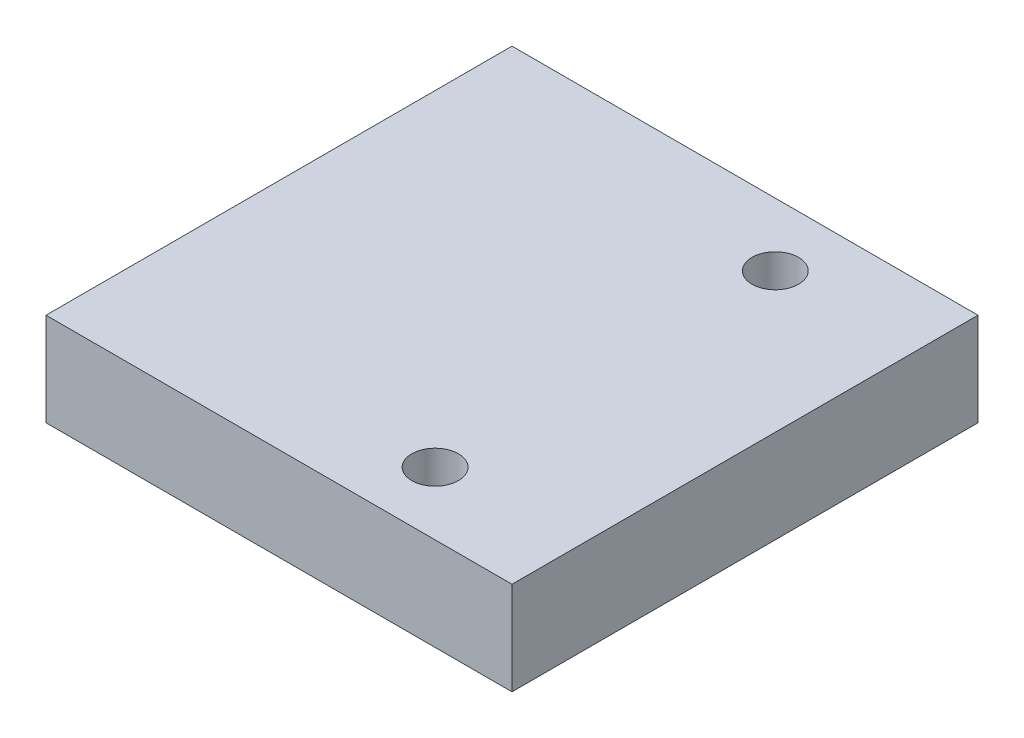
ISO-10303-21;
HEADER;
FILE_DESCRIPTION(('STEP AP214'),'2;1');
FILE_NAME('part.step','',(''),(''),'','','');
FILE_SCHEMA(('AUTOMOTIVE_DESIGN { 1 0 10303 214 1 1 1 1 }'));
ENDSEC;
DATA;
#1=APPLICATION_CONTEXT('core data for automotive mechanical design processes');
#2=APPLICATION_PROTOCOL_DEFINITION('international standard','automotive_design',2000,#1);
#3=PRODUCT_CONTEXT('',#1,'mechanical');
#4=PRODUCT('Part','Part','',(#3));
#5=PRODUCT_RELATED_PRODUCT_CATEGORY('part','',(#4));
#6=PRODUCT_DEFINITION_FORMATION('','',#4);
#7=PRODUCT_DEFINITION_CONTEXT('part definition',#1,'design');
#8=PRODUCT_DEFINITION('design','',#6,#7);
#9=PRODUCT_DEFINITION_SHAPE('','',#8);
#10=(LENGTH_UNIT() NAMED_UNIT(*) SI_UNIT(.MILLI.,.METRE.));
#11=(NAMED_UNIT(*) PLANE_ANGLE_UNIT() SI_UNIT($,.RADIAN.));
#12=(NAMED_UNIT(*) SI_UNIT($,.STERADIAN.) SOLID_ANGLE_UNIT());
#13=UNCERTAINTY_MEASURE_WITH_UNIT(LENGTH_MEASURE(1.E-05),#10,'distance_accuracy_value','');
#14=(GEOMETRIC_REPRESENTATION_CONTEXT(3) GLOBAL_UNCERTAINTY_ASSIGNED_CONTEXT((#13)) GLOBAL_UNIT_ASSIGNED_CONTEXT((#10,
#11,#12)) REPRESENTATION_CONTEXT('',''));
#15=CARTESIAN_POINT('',(0.,0.,0.));
#16=DIRECTION('',(0.,0.,1.));
#17=DIRECTION('',(1.,0.,0.));
#18=AXIS2_PLACEMENT_3D('',#15,#16,#17);
#19=CARTESIAN_POINT('',(25.,10.,25.));
#20=DIRECTION('',(-1.,0.,0.));
#21=DIRECTION('',(0.,0.,1.));
#22=AXIS2_PLACEMENT_3D('',#19,#20,#21);
#23=PLANE('',#22);
#24=DIRECTION('',(0.,0.,-1.));
#25=VECTOR('',#24,1.);
#26=CARTESIAN_POINT('',(25.,0.,25.));
#27=LINE('',#26,#25);
#28=CARTESIAN_POINT('',(25.,0.,25.));
#29=VERTEX_POINT('',#28);
#30=CARTESIAN_POINT('',(25.,0.,-25.));
#31=VERTEX_POINT('',#30);
#32=EDGE_CURVE('E98',#29,#31,#27,.T.);
#33=ORIENTED_EDGE('',*,*,#32,.T.);
#34=DIRECTION('',(0.,-1.,0.));
#35=VECTOR('',#34,1.);
#36=CARTESIAN_POINT('',(25.,10.,-25.));
#37=LINE('',#36,#35);
#38=CARTESIAN_POINT('',(25.,10.,-25.));
#39=VERTEX_POINT('',#38);
#40=EDGE_CURVE('E11',#39,#31,#37,.T.);
#41=ORIENTED_EDGE('',*,*,#40,.F.);
#42=DIRECTION('',(0.,0.,-1.));
#43=VECTOR('',#42,1.);
#44=CARTESIAN_POINT('',(25.,10.,25.));
#45=LINE('',#44,#43);
#46=CARTESIAN_POINT('',(25.,10.,25.));
#47=VERTEX_POINT('',#46);
#48=EDGE_CURVE('E86',#47,#39,#45,.T.);
#49=ORIENTED_EDGE('',*,*,#48,.F.);
#50=DIRECTION('',(0.,-1.,0.));
#51=VECTOR('',#50,1.);
#52=CARTESIAN_POINT('',(25.,10.,25.));
#53=LINE('',#52,#51);
#54=EDGE_CURVE('E94',#47,#29,#53,.T.);
#55=ORIENTED_EDGE('',*,*,#54,.T.);
#56=EDGE_LOOP('',(#33,#41,#49,#55));
#57=FACE_BOUND('',#56,.T.);
#58=ADVANCED_FACE('F35',(#57),#23,.F.);
#59=CARTESIAN_POINT('',(-25.,10.,-25.));
#60=DIRECTION('',(0.,0.,1.));
#61=DIRECTION('',(1.,0.,0.));
#62=AXIS2_PLACEMENT_3D('',#59,#60,#61);
#63=PLANE('',#62);
#64=DIRECTION('',(-1.,0.,0.));
#65=VECTOR('',#64,1.);
#66=CARTESIAN_POINT('',(-25.,0.,-25.));
#67=LINE('',#66,#65);
#68=CARTESIAN_POINT('',(-25.,0.,-25.));
#69=VERTEX_POINT('',#68);
#70=EDGE_CURVE('E90',#31,#69,#67,.T.);
#71=ORIENTED_EDGE('',*,*,#70,.T.);
#72=DIRECTION('',(0.,-1.,0.));
#73=VECTOR('',#72,1.);
#74=CARTESIAN_POINT('',(-25.,10.,-25.));
#75=LINE('',#74,#73);
#76=CARTESIAN_POINT('',(-25.,10.,-25.));
#77=VERTEX_POINT('',#76);
#78=EDGE_CURVE('E43',#77,#69,#75,.T.);
#79=ORIENTED_EDGE('',*,*,#78,.F.);
#80=DIRECTION('',(-1.,0.,0.));
#81=VECTOR('',#80,1.);
#82=CARTESIAN_POINT('',(-25.,10.,-25.));
#83=LINE('',#82,#81);
#84=EDGE_CURVE('E81',#39,#77,#83,.T.);
#85=ORIENTED_EDGE('',*,*,#84,.F.);
#86=ORIENTED_EDGE('',*,*,#40,.T.);
#87=EDGE_LOOP('',(#71,#79,#85,#86));
#88=FACE_BOUND('',#87,.T.);
#89=ADVANCED_FACE('F89',(#88),#63,.F.);
#90=CARTESIAN_POINT('',(-25.,10.,25.));
#91=DIRECTION('',(1.,0.,0.));
#92=DIRECTION('',(0.,0.,-1.));
#93=AXIS2_PLACEMENT_3D('',#90,#91,#92);
#94=PLANE('',#93);
#95=DIRECTION('',(0.,0.,1.));
#96=VECTOR('',#95,1.);
#97=CARTESIAN_POINT('',(-25.,0.,25.));
#98=LINE('',#97,#96);
#99=CARTESIAN_POINT('',(-25.,0.,25.));
#100=VERTEX_POINT('',#99);
#101=EDGE_CURVE('E68',#69,#100,#98,.T.);
#102=ORIENTED_EDGE('',*,*,#101,.T.);
#103=DIRECTION('',(0.,-1.,0.));
#104=VECTOR('',#103,1.);
#105=CARTESIAN_POINT('',(-25.,10.,25.));
#106=LINE('',#105,#104);
#107=CARTESIAN_POINT('',(-25.,10.,25.));
#108=VERTEX_POINT('',#107);
#109=EDGE_CURVE('E91',#108,#100,#106,.T.);
#110=ORIENTED_EDGE('',*,*,#109,.F.);
#111=DIRECTION('',(0.,0.,1.));
#112=VECTOR('',#111,1.);
#113=CARTESIAN_POINT('',(-25.,10.,25.));
#114=LINE('',#113,#112);
#115=EDGE_CURVE('E84',#77,#108,#114,.T.);
#116=ORIENTED_EDGE('',*,*,#115,.F.);
#117=ORIENTED_EDGE('',*,*,#78,.T.);
#118=EDGE_LOOP('',(#102,#110,#116,#117));
#119=FACE_BOUND('',#118,.T.);
#120=ADVANCED_FACE('F92',(#119),#94,.F.);
#121=CARTESIAN_POINT('',(-25.,10.,25.));
#122=DIRECTION('',(0.,0.,-1.));
#123=DIRECTION('',(-1.,0.,0.));
#124=AXIS2_PLACEMENT_3D('',#121,#122,#123);
#125=PLANE('',#124);
#126=DIRECTION('',(1.,0.,0.));
#127=VECTOR('',#126,1.);
#128=CARTESIAN_POINT('',(-25.,0.,25.));
#129=LINE('',#128,#127);
#130=EDGE_CURVE('E74',#100,#29,#129,.T.);
#131=ORIENTED_EDGE('',*,*,#130,.T.);
#132=ORIENTED_EDGE('',*,*,#54,.F.);
#133=DIRECTION('',(1.,0.,0.));
#134=VECTOR('',#133,1.);
#135=CARTESIAN_POINT('',(-25.,10.,25.));
#136=LINE('',#135,#134);
#137=EDGE_CURVE('E51',#108,#47,#136,.T.);
#138=ORIENTED_EDGE('',*,*,#137,.F.);
#139=ORIENTED_EDGE('',*,*,#109,.T.);
#140=EDGE_LOOP('',(#131,#132,#138,#139));
#141=FACE_BOUND('',#140,.T.);
#142=ADVANCED_FACE('F106',(#141),#125,.F.);
#143=CARTESIAN_POINT('',(0.,10.,0.));
#144=DIRECTION('',(0.,-1.,0.));
#145=DIRECTION('',(0.,0.,-1.));
#146=AXIS2_PLACEMENT_3D('',#143,#144,#145);
#147=PLANE('',#146);
#148=CARTESIAN_POINT('',(10.,10.,18.25));
#149=DIRECTION('',(0.,1.,0.));
#150=DIRECTION('',(0.,0.,1.));
#151=AXIS2_PLACEMENT_3D('',#148,#149,#150);
#152=CIRCLE('',#151,2.5);
#153=CARTESIAN_POINT('',(10.,10.,20.75));
#154=VERTEX_POINT('',#153);
#155=EDGE_CURVE('E118',#154,#154,#152,.T.);
#156=ORIENTED_EDGE('',*,*,#155,.F.);
#157=EDGE_LOOP('',(#156));
#158=FACE_BOUND('',#157,.T.);
#159=CARTESIAN_POINT('',(10.,10.,-18.25));
#160=DIRECTION('',(0.,1.,0.));
#161=DIRECTION('',(0.,0.,1.));
#162=AXIS2_PLACEMENT_3D('',#159,#160,#161);
#163=CIRCLE('',#162,2.5);
#164=CARTESIAN_POINT('',(10.,10.,-15.75));
#165=VERTEX_POINT('',#164);
#166=EDGE_CURVE('E112',#165,#165,#163,.T.);
#167=ORIENTED_EDGE('',*,*,#166,.F.);
#168=EDGE_LOOP('',(#167));
#169=FACE_BOUND('',#168,.T.);
#170=ORIENTED_EDGE('',*,*,#48,.T.);
#171=ORIENTED_EDGE('',*,*,#84,.T.);
#172=ORIENTED_EDGE('',*,*,#115,.T.);
#173=ORIENTED_EDGE('',*,*,#137,.T.);
#174=EDGE_LOOP('',(#170,#171,#172,#173));
#175=FACE_BOUND('',#174,.T.);
#176=ADVANCED_FACE('F82',(#158,#169,#175),#147,.F.);
#177=CARTESIAN_POINT('',(0.,0.,0.));
#178=DIRECTION('',(0.,-1.,0.));
#179=DIRECTION('',(0.,0.,-1.));
#180=AXIS2_PLACEMENT_3D('',#177,#178,#179);
#181=PLANE('',#180);
#182=CARTESIAN_POINT('',(10.,0.,18.25));
#183=DIRECTION('',(0.,1.,0.));
#184=DIRECTION('',(0.,0.,1.));
#185=AXIS2_PLACEMENT_3D('',#182,#183,#184);
#186=CIRCLE('',#185,2.5);
#187=CARTESIAN_POINT('',(10.,0.,20.75));
#188=VERTEX_POINT('',#187);
#189=EDGE_CURVE('E115',#188,#188,#186,.T.);
#190=ORIENTED_EDGE('',*,*,#189,.T.);
#191=EDGE_LOOP('',(#190));
#192=FACE_BOUND('',#191,.T.);
#193=CARTESIAN_POINT('',(10.,0.,-18.25));
#194=DIRECTION('',(0.,1.,0.));
#195=DIRECTION('',(0.,0.,1.));
#196=AXIS2_PLACEMENT_3D('',#193,#194,#195);
#197=CIRCLE('',#196,2.5);
#198=CARTESIAN_POINT('',(10.,0.,-15.75));
#199=VERTEX_POINT('',#198);
#200=EDGE_CURVE('E101',#199,#199,#197,.T.);
#201=ORIENTED_EDGE('',*,*,#200,.T.);
#202=EDGE_LOOP('',(#201));
#203=FACE_BOUND('',#202,.T.);
#204=ORIENTED_EDGE('',*,*,#32,.F.);
#205=ORIENTED_EDGE('',*,*,#130,.F.);
#206=ORIENTED_EDGE('',*,*,#101,.F.);
#207=ORIENTED_EDGE('',*,*,#70,.F.);
#208=EDGE_LOOP('',(#204,#205,#206,#207));
#209=FACE_BOUND('',#208,.T.);
#210=ADVANCED_FACE('F109',(#192,#203,#209),#181,.T.);
#211=CARTESIAN_POINT('',(10.,0.,-18.25));
#212=DIRECTION('',(0.,1.,0.));
#213=DIRECTION('',(0.,0.,1.));
#214=AXIS2_PLACEMENT_3D('',#211,#212,#213);
#215=CYLINDRICAL_SURFACE('',#214,2.5);
#216=ORIENTED_EDGE('',*,*,#200,.F.);
#217=EDGE_LOOP('',(#216));
#218=FACE_BOUND('',#217,.T.);
#219=ORIENTED_EDGE('',*,*,#166,.T.);
#220=EDGE_LOOP('',(#219));
#221=FACE_BOUND('',#220,.T.);
#222=ADVANCED_FACE('F129',(#218,#221),#215,.F.);
#223=CARTESIAN_POINT('',(10.,0.,18.25));
#224=DIRECTION('',(0.,1.,0.));
#225=DIRECTION('',(0.,0.,1.));
#226=AXIS2_PLACEMENT_3D('',#223,#224,#225);
#227=CYLINDRICAL_SURFACE('',#226,2.5);
#228=ORIENTED_EDGE('',*,*,#189,.F.);
#229=EDGE_LOOP('',(#228));
#230=FACE_BOUND('',#229,.T.);
#231=ORIENTED_EDGE('',*,*,#155,.T.);
#232=EDGE_LOOP('',(#231));
#233=FACE_BOUND('',#232,.T.);
#234=ADVANCED_FACE('F126',(#230,#233),#227,.F.);
#235=CLOSED_SHELL('',(#58,#89,#120,#142,#176,#210,#222,#234));
#236=MANIFOLD_SOLID_BREP('B2',#235);
#237=ADVANCED_BREP_SHAPE_REPRESENTATION('',(#18,#236),#14);
#238=SHAPE_DEFINITION_REPRESENTATION(#9,#237);
ENDSEC;
END-ISO-10303-21;
